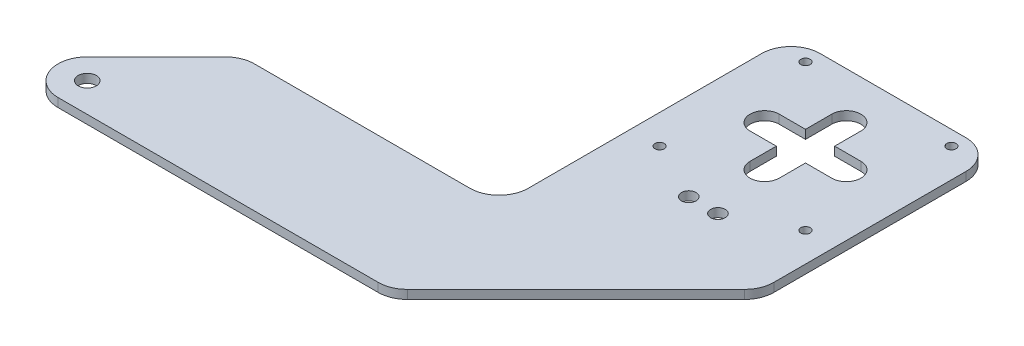
ISO-10303-21;
HEADER;
FILE_DESCRIPTION(('STEP AP214'),'2;1');
FILE_NAME('part.step','',(''),(''),'','','');
FILE_SCHEMA(('AUTOMOTIVE_DESIGN { 1 0 10303 214 1 1 1 1 }'));
ENDSEC;
DATA;
#1=APPLICATION_CONTEXT('core data for automotive mechanical design processes');
#2=APPLICATION_PROTOCOL_DEFINITION('international standard','automotive_design',2000,#1);
#3=PRODUCT_CONTEXT('',#1,'mechanical');
#4=PRODUCT('Part','Part','',(#3));
#5=PRODUCT_RELATED_PRODUCT_CATEGORY('part','',(#4));
#6=PRODUCT_DEFINITION_FORMATION('','',#4);
#7=PRODUCT_DEFINITION_CONTEXT('part definition',#1,'design');
#8=PRODUCT_DEFINITION('design','',#6,#7);
#9=PRODUCT_DEFINITION_SHAPE('','',#8);
#10=(LENGTH_UNIT() NAMED_UNIT(*) SI_UNIT(.MILLI.,.METRE.));
#11=(NAMED_UNIT(*) PLANE_ANGLE_UNIT() SI_UNIT($,.RADIAN.));
#12=(NAMED_UNIT(*) SI_UNIT($,.STERADIAN.) SOLID_ANGLE_UNIT());
#13=UNCERTAINTY_MEASURE_WITH_UNIT(LENGTH_MEASURE(1.E-05),#10,'distance_accuracy_value','');
#14=(GEOMETRIC_REPRESENTATION_CONTEXT(3) GLOBAL_UNCERTAINTY_ASSIGNED_CONTEXT((#13)) GLOBAL_UNIT_ASSIGNED_CONTEXT((#10,
#11,#12)) REPRESENTATION_CONTEXT('',''));
#15=CARTESIAN_POINT('',(0.,0.,0.));
#16=DIRECTION('',(0.,0.,1.));
#17=DIRECTION('',(1.,0.,0.));
#18=AXIS2_PLACEMENT_3D('',#15,#16,#17);
#19=CARTESIAN_POINT('',(0.,3.,0.));
#20=DIRECTION('',(0.,-1.,0.));
#21=DIRECTION('',(0.,0.,-1.));
#22=AXIS2_PLACEMENT_3D('',#19,#20,#21);
#23=PLANE('',#22);
#24=DIRECTION('',(1.,0.,0.));
#25=VECTOR('',#24,1.);
#26=CARTESIAN_POINT('',(11.,3.,-20.));
#27=LINE('',#26,#25);
#28=CARTESIAN_POINT('',(11.,3.,-20.));
#29=VERTEX_POINT('',#28);
#30=CARTESIAN_POINT('',(20.,3.,-20.));
#31=VERTEX_POINT('',#30);
#32=EDGE_CURVE('E258',#29,#31,#27,.T.);
#33=ORIENTED_EDGE('',*,*,#32,.F.);
#34=CARTESIAN_POINT('',(11.,3.,-25.));
#35=DIRECTION('',(0.,1.,0.));
#36=DIRECTION('',(0.,0.,1.));
#37=AXIS2_PLACEMENT_3D('',#34,#35,#36);
#38=CIRCLE('',#37,5.);
#39=CARTESIAN_POINT('',(11.,3.,-30.));
#40=VERTEX_POINT('',#39);
#41=EDGE_CURVE('E50',#40,#29,#38,.T.);
#42=ORIENTED_EDGE('',*,*,#41,.F.);
#43=DIRECTION('',(-1.,0.,0.));
#44=VECTOR('',#43,1.);
#45=CARTESIAN_POINT('',(11.,3.,-30.));
#46=LINE('',#45,#44);
#47=CARTESIAN_POINT('',(20.,3.,-30.));
#48=VERTEX_POINT('',#47);
#49=EDGE_CURVE('E226',#48,#40,#46,.T.);
#50=ORIENTED_EDGE('',*,*,#49,.F.);
#51=DIRECTION('',(0.,0.,1.));
#52=VECTOR('',#51,1.);
#53=CARTESIAN_POINT('',(20.,3.,-39.));
#54=LINE('',#53,#52);
#55=CARTESIAN_POINT('',(20.,3.,-39.));
#56=VERTEX_POINT('',#55);
#57=EDGE_CURVE('E229',#56,#48,#54,.T.);
#58=ORIENTED_EDGE('',*,*,#57,.F.);
#59=CARTESIAN_POINT('',(25.,3.,-39.));
#60=DIRECTION('',(0.,1.,0.));
#61=DIRECTION('',(0.,0.,-1.));
#62=AXIS2_PLACEMENT_3D('',#59,#60,#61);
#63=CIRCLE('',#62,4.99999999999999);
#64=CARTESIAN_POINT('',(30.,3.,-39.));
#65=VERTEX_POINT('',#64);
#66=EDGE_CURVE('E282',#65,#56,#63,.T.);
#67=ORIENTED_EDGE('',*,*,#66,.F.);
#68=DIRECTION('',(0.,0.,-1.));
#69=VECTOR('',#68,1.);
#70=CARTESIAN_POINT('',(30.,3.,-39.));
#71=LINE('',#70,#69);
#72=CARTESIAN_POINT('',(30.,3.,-30.));
#73=VERTEX_POINT('',#72);
#74=EDGE_CURVE('E279',#73,#65,#71,.T.);
#75=ORIENTED_EDGE('',*,*,#74,.F.);
#76=DIRECTION('',(-1.,0.,0.));
#77=VECTOR('',#76,1.);
#78=CARTESIAN_POINT('',(30.,3.,-30.));
#79=LINE('',#78,#77);
#80=CARTESIAN_POINT('',(39.,3.,-30.));
#81=VERTEX_POINT('',#80);
#82=EDGE_CURVE('E276',#81,#73,#79,.T.);
#83=ORIENTED_EDGE('',*,*,#82,.F.);
#84=CARTESIAN_POINT('',(39.,3.,-25.));
#85=DIRECTION('',(0.,1.,0.));
#86=DIRECTION('',(0.,0.,1.));
#87=AXIS2_PLACEMENT_3D('',#84,#85,#86);
#88=CIRCLE('',#87,5.);
#89=CARTESIAN_POINT('',(39.,3.,-20.));
#90=VERTEX_POINT('',#89);
#91=EDGE_CURVE('E273',#90,#81,#88,.T.);
#92=ORIENTED_EDGE('',*,*,#91,.F.);
#93=DIRECTION('',(1.,0.,0.));
#94=VECTOR('',#93,1.);
#95=CARTESIAN_POINT('',(30.,3.,-20.));
#96=LINE('',#95,#94);
#97=CARTESIAN_POINT('',(30.,3.,-20.));
#98=VERTEX_POINT('',#97);
#99=EDGE_CURVE('E270',#98,#90,#96,.T.);
#100=ORIENTED_EDGE('',*,*,#99,.F.);
#101=DIRECTION('',(0.,0.,-1.));
#102=VECTOR('',#101,1.);
#103=CARTESIAN_POINT('',(30.,3.,-20.));
#104=LINE('',#103,#102);
#105=CARTESIAN_POINT('',(30.,3.,-11.));
#106=VERTEX_POINT('',#105);
#107=EDGE_CURVE('E267',#106,#98,#104,.T.);
#108=ORIENTED_EDGE('',*,*,#107,.F.);
#109=CARTESIAN_POINT('',(25.,3.,-11.));
#110=DIRECTION('',(0.,1.,0.));
#111=DIRECTION('',(0.,0.,-1.));
#112=AXIS2_PLACEMENT_3D('',#109,#110,#111);
#113=CIRCLE('',#112,4.99999999999999);
#114=CARTESIAN_POINT('',(20.,3.,-11.));
#115=VERTEX_POINT('',#114);
#116=EDGE_CURVE('E264',#115,#106,#113,.T.);
#117=ORIENTED_EDGE('',*,*,#116,.F.);
#118=DIRECTION('',(0.,0.,1.));
#119=VECTOR('',#118,1.);
#120=CARTESIAN_POINT('',(20.,3.,-20.));
#121=LINE('',#120,#119);
#122=EDGE_CURVE('E261',#31,#115,#121,.T.);
#123=ORIENTED_EDGE('',*,*,#122,.F.);
#124=EDGE_LOOP('',(#33,#42,#50,#58,#67,#75,#83,#92,#100,#108,#117,#123));
#125=FACE_BOUND('',#124,.T.);
#126=CARTESIAN_POINT('',(20.,3.,10.));
#127=DIRECTION('',(0.,1.,0.));
#128=DIRECTION('',(0.,0.,1.));
#129=AXIS2_PLACEMENT_3D('',#126,#127,#128);
#130=CIRCLE('',#129,2.5);
#131=CARTESIAN_POINT('',(20.,3.,12.5));
#132=VERTEX_POINT('',#131);
#133=EDGE_CURVE('E311',#132,#132,#130,.T.);
#134=ORIENTED_EDGE('',*,*,#133,.F.);
#135=EDGE_LOOP('',(#134));
#136=FACE_BOUND('',#135,.T.);
#137=CARTESIAN_POINT('',(30.,3.,10.));
#138=DIRECTION('',(0.,1.,0.));
#139=DIRECTION('',(0.,0.,-1.));
#140=AXIS2_PLACEMENT_3D('',#137,#138,#139);
#141=CIRCLE('',#140,2.5);
#142=CARTESIAN_POINT('',(30.,3.,7.5));
#143=VERTEX_POINT('',#142);
#144=EDGE_CURVE('E317',#143,#143,#141,.T.);
#145=ORIENTED_EDGE('',*,*,#144,.F.);
#146=EDGE_LOOP('',(#145));
#147=FACE_BOUND('',#146,.T.);
#148=CARTESIAN_POINT('',(-117.497474683059,3.,78.639610306789));
#149=DIRECTION('',(0.,1.,0.));
#150=DIRECTION('',(0.,0.,1.));
#151=AXIS2_PLACEMENT_3D('',#148,#149,#150);
#152=CIRCLE('',#151,3.09999999999999);
#153=CARTESIAN_POINT('',(-117.497474683059,3.,81.739610306789));
#154=VERTEX_POINT('',#153);
#155=EDGE_CURVE('E289',#154,#154,#152,.T.);
#156=ORIENTED_EDGE('',*,*,#155,.F.);
#157=EDGE_LOOP('',(#156));
#158=FACE_BOUND('',#157,.T.);
#159=DIRECTION('',(-0.707106781186549,0.,0.707106781186546));
#160=VECTOR('',#159,1.);
#161=CARTESIAN_POINT('',(-141.63961030679,3.,88.639610306789));
#162=LINE('',#161,#160);
#163=CARTESIAN_POINT('',(-100.928932188135,3.,47.9289321881345));
#164=VERTEX_POINT('',#163);
#165=CARTESIAN_POINT('',(-124.568542494924,3.,71.5685424949234));
#166=VERTEX_POINT('',#165);
#167=EDGE_CURVE('E325',#164,#166,#162,.T.);
#168=ORIENTED_EDGE('',*,*,#167,.T.);
#169=CARTESIAN_POINT('',(-117.497474683059,3.,78.6396103067889));
#170=DIRECTION('',(0.,-1.,0.));
#171=DIRECTION('',(0.,0.,-1.));
#172=AXIS2_PLACEMENT_3D('',#169,#170,#171);
#173=CIRCLE('',#172,10.);
#174=CARTESIAN_POINT('',(-117.497474683059,3.,88.639610306789));
#175=VERTEX_POINT('',#174);
#176=EDGE_CURVE('E43',#166,#175,#173,.F.);
#177=ORIENTED_EDGE('',*,*,#176,.T.);
#178=DIRECTION('',(1.,0.,0.));
#179=VECTOR('',#178,1.);
#180=CARTESIAN_POINT('',(-141.63961030679,3.,88.639610306789));
#181=LINE('',#180,#179);
#182=CARTESIAN_POINT('',(-7.78174593052058,3.,88.6396103067889));
#183=VERTEX_POINT('',#182);
#184=EDGE_CURVE('E329',#175,#183,#181,.T.);
#185=ORIENTED_EDGE('',*,*,#184,.T.);
#186=CARTESIAN_POINT('',(-7.78174593052053,3.,78.639610306789));
#187=DIRECTION('',(0.,-1.,0.));
#188=DIRECTION('',(0.,0.,-1.));
#189=AXIS2_PLACEMENT_3D('',#186,#187,#188);
#190=CIRCLE('',#189,10.);
#191=CARTESIAN_POINT('',(-0.710678118655064,3.,85.7106781186545));
#192=VERTEX_POINT('',#191);
#193=EDGE_CURVE('E409',#183,#192,#190,.F.);
#194=ORIENTED_EDGE('',*,*,#193,.T.);
#195=DIRECTION('',(0.707106781186551,0.,-0.707106781186544));
#196=VECTOR('',#195,1.);
#197=CARTESIAN_POINT('',(60.,3.,25.));
#198=LINE('',#197,#196);
#199=CARTESIAN_POINT('',(57.0710678118654,3.,27.9289321881345));
#200=VERTEX_POINT('',#199);
#201=EDGE_CURVE('E331',#192,#200,#198,.T.);
#202=ORIENTED_EDGE('',*,*,#201,.T.);
#203=CARTESIAN_POINT('',(50.,3.,20.857864376269));
#204=DIRECTION('',(0.,-1.,0.));
#205=DIRECTION('',(0.,0.,-1.));
#206=AXIS2_PLACEMENT_3D('',#203,#204,#205);
#207=CIRCLE('',#206,10.);
#208=CARTESIAN_POINT('',(60.,3.,20.857864376269));
#209=VERTEX_POINT('',#208);
#210=EDGE_CURVE('E403',#200,#209,#207,.F.);
#211=ORIENTED_EDGE('',*,*,#210,.T.);
#212=DIRECTION('',(0.,0.,-1.));
#213=VECTOR('',#212,1.);
#214=CARTESIAN_POINT('',(60.,3.,5.));
#215=LINE('',#214,#213);
#216=CARTESIAN_POINT('',(60.,3.,-45.));
#217=VERTEX_POINT('',#216);
#218=EDGE_CURVE('E369',#209,#217,#215,.T.);
#219=ORIENTED_EDGE('',*,*,#218,.T.);
#220=CARTESIAN_POINT('',(50.,3.,-45.));
#221=DIRECTION('',(0.,-1.,0.));
#222=DIRECTION('',(0.,0.,-1.));
#223=AXIS2_PLACEMENT_3D('',#220,#221,#222);
#224=CIRCLE('',#223,10.);
#225=CARTESIAN_POINT('',(50.,3.,-55.));
#226=VERTEX_POINT('',#225);
#227=EDGE_CURVE('E405',#217,#226,#224,.F.);
#228=ORIENTED_EDGE('',*,*,#227,.T.);
#229=DIRECTION('',(-1.,0.,0.));
#230=VECTOR('',#229,1.);
#231=CARTESIAN_POINT('',(-10.,3.,-55.));
#232=LINE('',#231,#230);
#233=CARTESIAN_POINT('',(0.,3.,-55.));
#234=VERTEX_POINT('',#233);
#235=EDGE_CURVE('E372',#226,#234,#232,.T.);
#236=ORIENTED_EDGE('',*,*,#235,.T.);
#237=CARTESIAN_POINT('',(0.,3.,-45.));
#238=DIRECTION('',(0.,-1.,0.));
#239=DIRECTION('',(0.,0.,-1.));
#240=AXIS2_PLACEMENT_3D('',#237,#238,#239);
#241=CIRCLE('',#240,10.);
#242=CARTESIAN_POINT('',(-10.,3.,-45.));
#243=VERTEX_POINT('',#242);
#244=EDGE_CURVE('E407',#234,#243,#241,.F.);
#245=ORIENTED_EDGE('',*,*,#244,.T.);
#246=DIRECTION('',(0.,0.,1.));
#247=VECTOR('',#246,1.);
#248=CARTESIAN_POINT('',(-10.,3.,5.));
#249=LINE('',#248,#247);
#250=CARTESIAN_POINT('',(-10.,3.,35.));
#251=VERTEX_POINT('',#250);
#252=EDGE_CURVE('E376',#243,#251,#249,.T.);
#253=ORIENTED_EDGE('',*,*,#252,.T.);
#254=CARTESIAN_POINT('',(-20.,3.,35.));
#255=DIRECTION('',(0.,-1.,0.));
#256=DIRECTION('',(0.,0.,-1.));
#257=AXIS2_PLACEMENT_3D('',#254,#255,#256);
#258=CIRCLE('',#257,10.);
#259=CARTESIAN_POINT('',(-20.,3.,45.));
#260=VERTEX_POINT('',#259);
#261=EDGE_CURVE('E431',#251,#260,#258,.T.);
#262=ORIENTED_EDGE('',*,*,#261,.T.);
#263=DIRECTION('',(-1.,0.,0.));
#264=VECTOR('',#263,1.);
#265=CARTESIAN_POINT('',(-9.99999999999999,3.,45.));
#266=LINE('',#265,#264);
#267=CARTESIAN_POINT('',(-93.8578643762696,3.,45.));
#268=VERTEX_POINT('',#267);
#269=EDGE_CURVE('E322',#260,#268,#266,.T.);
#270=ORIENTED_EDGE('',*,*,#269,.T.);
#271=CARTESIAN_POINT('',(-93.8578643762696,3.,55.));
#272=DIRECTION('',(0.,-1.,0.));
#273=DIRECTION('',(0.,0.,-1.));
#274=AXIS2_PLACEMENT_3D('',#271,#272,#273);
#275=CIRCLE('',#274,10.);
#276=EDGE_CURVE('E445',#268,#164,#275,.F.);
#277=ORIENTED_EDGE('',*,*,#276,.T.);
#278=EDGE_LOOP('',(#168,#177,#185,#194,#202,#211,#219,#228,#236,#245,#253,#262,#270,#277));
#279=FACE_BOUND('',#278,.T.);
#280=CARTESIAN_POINT('',(0.,3.,-50.));
#281=DIRECTION('',(0.,1.,0.));
#282=DIRECTION('',(0.,0.,1.));
#283=AXIS2_PLACEMENT_3D('',#280,#281,#282);
#284=CIRCLE('',#283,1.6);
#285=CARTESIAN_POINT('',(0.,3.,-48.4));
#286=VERTEX_POINT('',#285);
#287=EDGE_CURVE('E363',#286,#286,#284,.T.);
#288=ORIENTED_EDGE('',*,*,#287,.F.);
#289=EDGE_LOOP('',(#288));
#290=FACE_BOUND('',#289,.T.);
#291=CARTESIAN_POINT('',(50.,3.,-50.));
#292=DIRECTION('',(0.,1.,0.));
#293=DIRECTION('',(0.,0.,-1.));
#294=AXIS2_PLACEMENT_3D('',#291,#292,#293);
#295=CIRCLE('',#294,1.60000000000001);
#296=CARTESIAN_POINT('',(50.,3.,-51.6));
#297=VERTEX_POINT('',#296);
#298=EDGE_CURVE('E357',#297,#297,#295,.T.);
#299=ORIENTED_EDGE('',*,*,#298,.F.);
#300=EDGE_LOOP('',(#299));
#301=FACE_BOUND('',#300,.T.);
#302=CARTESIAN_POINT('',(50.,3.,0.));
#303=DIRECTION('',(0.,1.,0.));
#304=DIRECTION('',(0.,0.,1.));
#305=AXIS2_PLACEMENT_3D('',#302,#303,#304);
#306=CIRCLE('',#305,1.60000000000001);
#307=CARTESIAN_POINT('',(50.,3.,1.60000000000001));
#308=VERTEX_POINT('',#307);
#309=EDGE_CURVE('E351',#308,#308,#306,.T.);
#310=ORIENTED_EDGE('',*,*,#309,.F.);
#311=EDGE_LOOP('',(#310));
#312=FACE_BOUND('',#311,.T.);
#313=CARTESIAN_POINT('',(0.,3.,0.));
#314=DIRECTION('',(0.,1.,0.));
#315=DIRECTION('',(0.,0.,-1.));
#316=AXIS2_PLACEMENT_3D('',#313,#314,#315);
#317=CIRCLE('',#316,1.6);
#318=CARTESIAN_POINT('',(0.,3.,-1.6));
#319=VERTEX_POINT('',#318);
#320=EDGE_CURVE('E345',#319,#319,#317,.T.);
#321=ORIENTED_EDGE('',*,*,#320,.F.);
#322=EDGE_LOOP('',(#321));
#323=FACE_BOUND('',#322,.T.);
#324=ADVANCED_FACE('F34',(#125,#136,#147,#158,#279,#290,#301,#312,#323),#23,.F.);
#325=CARTESIAN_POINT('',(0.,0.,0.));
#326=DIRECTION('',(0.,-1.,0.));
#327=DIRECTION('',(0.,0.,-1.));
#328=AXIS2_PLACEMENT_3D('',#325,#326,#327);
#329=PLANE('',#328);
#330=CARTESIAN_POINT('',(11.,0.,-25.));
#331=DIRECTION('',(0.,1.,0.));
#332=DIRECTION('',(0.,0.,1.));
#333=AXIS2_PLACEMENT_3D('',#330,#331,#332);
#334=CIRCLE('',#333,5.);
#335=CARTESIAN_POINT('',(11.,0.,-30.));
#336=VERTEX_POINT('',#335);
#337=CARTESIAN_POINT('',(11.,0.,-20.));
#338=VERTEX_POINT('',#337);
#339=EDGE_CURVE('E209',#336,#338,#334,.T.);
#340=ORIENTED_EDGE('',*,*,#339,.T.);
#341=DIRECTION('',(1.,0.,0.));
#342=VECTOR('',#341,1.);
#343=CARTESIAN_POINT('',(11.,0.,-20.));
#344=LINE('',#343,#342);
#345=CARTESIAN_POINT('',(20.,0.,-20.));
#346=VERTEX_POINT('',#345);
#347=EDGE_CURVE('E218',#338,#346,#344,.T.);
#348=ORIENTED_EDGE('',*,*,#347,.T.);
#349=DIRECTION('',(0.,0.,1.));
#350=VECTOR('',#349,1.);
#351=CARTESIAN_POINT('',(20.,0.,-20.));
#352=LINE('',#351,#350);
#353=CARTESIAN_POINT('',(20.,0.,-11.));
#354=VERTEX_POINT('',#353);
#355=EDGE_CURVE('E58',#346,#354,#352,.T.);
#356=ORIENTED_EDGE('',*,*,#355,.T.);
#357=CARTESIAN_POINT('',(25.,0.,-11.));
#358=DIRECTION('',(0.,1.,0.));
#359=DIRECTION('',(0.,0.,-1.));
#360=AXIS2_PLACEMENT_3D('',#357,#358,#359);
#361=CIRCLE('',#360,4.99999999999999);
#362=CARTESIAN_POINT('',(30.,0.,-11.));
#363=VERTEX_POINT('',#362);
#364=EDGE_CURVE('E233',#354,#363,#361,.T.);
#365=ORIENTED_EDGE('',*,*,#364,.T.);
#366=DIRECTION('',(0.,0.,-1.));
#367=VECTOR('',#366,1.);
#368=CARTESIAN_POINT('',(30.,0.,-20.));
#369=LINE('',#368,#367);
#370=CARTESIAN_POINT('',(30.,0.,-20.));
#371=VERTEX_POINT('',#370);
#372=EDGE_CURVE('E236',#363,#371,#369,.T.);
#373=ORIENTED_EDGE('',*,*,#372,.T.);
#374=DIRECTION('',(1.,0.,0.));
#375=VECTOR('',#374,1.);
#376=CARTESIAN_POINT('',(30.,0.,-20.));
#377=LINE('',#376,#375);
#378=CARTESIAN_POINT('',(39.,0.,-20.));
#379=VERTEX_POINT('',#378);
#380=EDGE_CURVE('E239',#371,#379,#377,.T.);
#381=ORIENTED_EDGE('',*,*,#380,.T.);
#382=CARTESIAN_POINT('',(39.,0.,-25.));
#383=DIRECTION('',(0.,1.,0.));
#384=DIRECTION('',(0.,0.,1.));
#385=AXIS2_PLACEMENT_3D('',#382,#383,#384);
#386=CIRCLE('',#385,5.);
#387=CARTESIAN_POINT('',(39.,0.,-30.));
#388=VERTEX_POINT('',#387);
#389=EDGE_CURVE('E242',#379,#388,#386,.T.);
#390=ORIENTED_EDGE('',*,*,#389,.T.);
#391=DIRECTION('',(-1.,0.,0.));
#392=VECTOR('',#391,1.);
#393=CARTESIAN_POINT('',(30.,0.,-30.));
#394=LINE('',#393,#392);
#395=CARTESIAN_POINT('',(30.,0.,-30.));
#396=VERTEX_POINT('',#395);
#397=EDGE_CURVE('E245',#388,#396,#394,.T.);
#398=ORIENTED_EDGE('',*,*,#397,.T.);
#399=DIRECTION('',(0.,0.,-1.));
#400=VECTOR('',#399,1.);
#401=CARTESIAN_POINT('',(30.,0.,-39.));
#402=LINE('',#401,#400);
#403=CARTESIAN_POINT('',(30.,0.,-39.));
#404=VERTEX_POINT('',#403);
#405=EDGE_CURVE('E248',#396,#404,#402,.T.);
#406=ORIENTED_EDGE('',*,*,#405,.T.);
#407=CARTESIAN_POINT('',(25.,0.,-39.));
#408=DIRECTION('',(0.,1.,0.));
#409=DIRECTION('',(0.,0.,-1.));
#410=AXIS2_PLACEMENT_3D('',#407,#408,#409);
#411=CIRCLE('',#410,4.99999999999999);
#412=CARTESIAN_POINT('',(20.,0.,-39.));
#413=VERTEX_POINT('',#412);
#414=EDGE_CURVE('E251',#404,#413,#411,.T.);
#415=ORIENTED_EDGE('',*,*,#414,.T.);
#416=DIRECTION('',(0.,0.,1.));
#417=VECTOR('',#416,1.);
#418=CARTESIAN_POINT('',(20.,0.,-39.));
#419=LINE('',#418,#417);
#420=CARTESIAN_POINT('',(20.,0.,-30.));
#421=VERTEX_POINT('',#420);
#422=EDGE_CURVE('E254',#413,#421,#419,.T.);
#423=ORIENTED_EDGE('',*,*,#422,.T.);
#424=DIRECTION('',(-1.,0.,0.));
#425=VECTOR('',#424,1.);
#426=CARTESIAN_POINT('',(11.,0.,-30.));
#427=LINE('',#426,#425);
#428=EDGE_CURVE('E215',#421,#336,#427,.T.);
#429=ORIENTED_EDGE('',*,*,#428,.T.);
#430=EDGE_LOOP('',(#340,#348,#356,#365,#373,#381,#390,#398,#406,#415,#423,#429));
#431=FACE_BOUND('',#430,.T.);
#432=CARTESIAN_POINT('',(20.,0.,10.));
#433=DIRECTION('',(0.,1.,0.));
#434=DIRECTION('',(0.,0.,1.));
#435=AXIS2_PLACEMENT_3D('',#432,#433,#434);
#436=CIRCLE('',#435,2.5);
#437=CARTESIAN_POINT('',(20.,0.,12.5));
#438=VERTEX_POINT('',#437);
#439=EDGE_CURVE('E259',#438,#438,#436,.T.);
#440=ORIENTED_EDGE('',*,*,#439,.T.);
#441=EDGE_LOOP('',(#440));
#442=FACE_BOUND('',#441,.T.);
#443=CARTESIAN_POINT('',(30.,0.,10.));
#444=DIRECTION('',(0.,1.,0.));
#445=DIRECTION('',(0.,0.,-1.));
#446=AXIS2_PLACEMENT_3D('',#443,#444,#445);
#447=CIRCLE('',#446,2.5);
#448=CARTESIAN_POINT('',(30.,0.,7.5));
#449=VERTEX_POINT('',#448);
#450=EDGE_CURVE('E314',#449,#449,#447,.T.);
#451=ORIENTED_EDGE('',*,*,#450,.T.);
#452=EDGE_LOOP('',(#451));
#453=FACE_BOUND('',#452,.T.);
#454=CARTESIAN_POINT('',(-117.497474683059,0.,78.639610306789));
#455=DIRECTION('',(0.,-1.,0.));
#456=DIRECTION('',(0.,0.,-1.));
#457=AXIS2_PLACEMENT_3D('',#454,#455,#456);
#458=CIRCLE('',#457,3.09999999999999);
#459=CARTESIAN_POINT('',(-117.497474683059,0.,75.539610306789));
#460=VERTEX_POINT('',#459);
#461=EDGE_CURVE('E38',#460,#460,#458,.T.);
#462=ORIENTED_EDGE('',*,*,#461,.F.);
#463=EDGE_LOOP('',(#462));
#464=FACE_BOUND('',#463,.T.);
#465=CARTESIAN_POINT('',(50.,0.,0.));
#466=DIRECTION('',(0.,1.,0.));
#467=DIRECTION('',(0.,0.,1.));
#468=AXIS2_PLACEMENT_3D('',#465,#466,#467);
#469=CIRCLE('',#468,1.60000000000001);
#470=CARTESIAN_POINT('',(50.,0.,1.60000000000001));
#471=VERTEX_POINT('',#470);
#472=EDGE_CURVE('E348',#471,#471,#469,.T.);
#473=ORIENTED_EDGE('',*,*,#472,.T.);
#474=EDGE_LOOP('',(#473));
#475=FACE_BOUND('',#474,.T.);
#476=CARTESIAN_POINT('',(0.,0.,-50.));
#477=DIRECTION('',(0.,1.,0.));
#478=DIRECTION('',(0.,0.,1.));
#479=AXIS2_PLACEMENT_3D('',#476,#477,#478);
#480=CIRCLE('',#479,1.6);
#481=CARTESIAN_POINT('',(0.,0.,-48.4));
#482=VERTEX_POINT('',#481);
#483=EDGE_CURVE('E360',#482,#482,#480,.T.);
#484=ORIENTED_EDGE('',*,*,#483,.T.);
#485=EDGE_LOOP('',(#484));
#486=FACE_BOUND('',#485,.T.);
#487=DIRECTION('',(1.,0.,0.));
#488=VECTOR('',#487,1.);
#489=CARTESIAN_POINT('',(-58.1724445328613,0.,88.639610306789));
#490=LINE('',#489,#488);
#491=CARTESIAN_POINT('',(-117.497474683059,0.,88.6396103067889));
#492=VERTEX_POINT('',#491);
#493=CARTESIAN_POINT('',(-7.78174593052055,0.,88.639610306789));
#494=VERTEX_POINT('',#493);
#495=EDGE_CURVE('E341',#492,#494,#490,.T.);
#496=ORIENTED_EDGE('',*,*,#495,.F.);
#497=CARTESIAN_POINT('',(-117.497474683059,0.,78.6396103067889));
#498=DIRECTION('',(0.,-1.,0.));
#499=DIRECTION('',(0.,0.,-1.));
#500=AXIS2_PLACEMENT_3D('',#497,#498,#499);
#501=CIRCLE('',#500,10.);
#502=CARTESIAN_POINT('',(-124.568542494924,0.,71.5685424949234));
#503=VERTEX_POINT('',#502);
#504=EDGE_CURVE('E438',#492,#503,#501,.T.);
#505=ORIENTED_EDGE('',*,*,#504,.T.);
#506=DIRECTION('',(-0.707106781186549,0.,0.707106781186546));
#507=VECTOR('',#506,1.);
#508=CARTESIAN_POINT('',(-141.63961030679,0.,88.639610306789));
#509=LINE('',#508,#507);
#510=CARTESIAN_POINT('',(-100.928932188135,0.,47.9289321881345));
#511=VERTEX_POINT('',#510);
#512=EDGE_CURVE('E338',#511,#503,#509,.T.);
#513=ORIENTED_EDGE('',*,*,#512,.F.);
#514=CARTESIAN_POINT('',(-93.8578643762696,0.,55.));
#515=DIRECTION('',(0.,-1.,0.));
#516=DIRECTION('',(0.,0.,-1.));
#517=AXIS2_PLACEMENT_3D('',#514,#515,#516);
#518=CIRCLE('',#517,10.);
#519=CARTESIAN_POINT('',(-93.8578643762696,0.,45.));
#520=VERTEX_POINT('',#519);
#521=EDGE_CURVE('E436',#511,#520,#518,.T.);
#522=ORIENTED_EDGE('',*,*,#521,.T.);
#523=DIRECTION('',(-1.,0.,0.));
#524=VECTOR('',#523,1.);
#525=CARTESIAN_POINT('',(-9.99999999999999,0.,45.));
#526=LINE('',#525,#524);
#527=CARTESIAN_POINT('',(-20.,0.,45.));
#528=VERTEX_POINT('',#527);
#529=EDGE_CURVE('E335',#528,#520,#526,.T.);
#530=ORIENTED_EDGE('',*,*,#529,.F.);
#531=CARTESIAN_POINT('',(-20.,0.,35.));
#532=DIRECTION('',(0.,-1.,0.));
#533=DIRECTION('',(0.,0.,-1.));
#534=AXIS2_PLACEMENT_3D('',#531,#532,#533);
#535=CIRCLE('',#534,10.);
#536=CARTESIAN_POINT('',(-10.,0.,35.));
#537=VERTEX_POINT('',#536);
#538=EDGE_CURVE('E429',#528,#537,#535,.F.);
#539=ORIENTED_EDGE('',*,*,#538,.T.);
#540=DIRECTION('',(0.,0.,1.));
#541=VECTOR('',#540,1.);
#542=CARTESIAN_POINT('',(-10.,0.,5.));
#543=LINE('',#542,#541);
#544=CARTESIAN_POINT('',(-10.,0.,-45.));
#545=VERTEX_POINT('',#544);
#546=EDGE_CURVE('E373',#545,#537,#543,.T.);
#547=ORIENTED_EDGE('',*,*,#546,.F.);
#548=CARTESIAN_POINT('',(0.,0.,-45.));
#549=DIRECTION('',(0.,-1.,0.));
#550=DIRECTION('',(0.,0.,-1.));
#551=AXIS2_PLACEMENT_3D('',#548,#549,#550);
#552=CIRCLE('',#551,10.);
#553=CARTESIAN_POINT('',(0.,0.,-55.));
#554=VERTEX_POINT('',#553);
#555=EDGE_CURVE('E395',#545,#554,#552,.T.);
#556=ORIENTED_EDGE('',*,*,#555,.T.);
#557=DIRECTION('',(-1.,0.,0.));
#558=VECTOR('',#557,1.);
#559=CARTESIAN_POINT('',(-10.,0.,-55.));
#560=LINE('',#559,#558);
#561=CARTESIAN_POINT('',(50.,0.,-55.));
#562=VERTEX_POINT('',#561);
#563=EDGE_CURVE('E382',#562,#554,#560,.T.);
#564=ORIENTED_EDGE('',*,*,#563,.F.);
#565=CARTESIAN_POINT('',(50.,0.,-45.));
#566=DIRECTION('',(0.,-1.,0.));
#567=DIRECTION('',(0.,0.,-1.));
#568=AXIS2_PLACEMENT_3D('',#565,#566,#567);
#569=CIRCLE('',#568,10.);
#570=CARTESIAN_POINT('',(60.,0.,-45.));
#571=VERTEX_POINT('',#570);
#572=EDGE_CURVE('E393',#562,#571,#569,.T.);
#573=ORIENTED_EDGE('',*,*,#572,.T.);
#574=DIRECTION('',(0.,0.,-1.));
#575=VECTOR('',#574,1.);
#576=CARTESIAN_POINT('',(60.,0.,5.));
#577=LINE('',#576,#575);
#578=CARTESIAN_POINT('',(60.,0.,20.857864376269));
#579=VERTEX_POINT('',#578);
#580=EDGE_CURVE('E366',#579,#571,#577,.T.);
#581=ORIENTED_EDGE('',*,*,#580,.F.);
#582=CARTESIAN_POINT('',(50.,0.,20.857864376269));
#583=DIRECTION('',(0.,-1.,0.));
#584=DIRECTION('',(0.,0.,-1.));
#585=AXIS2_PLACEMENT_3D('',#582,#583,#584);
#586=CIRCLE('',#585,10.);
#587=CARTESIAN_POINT('',(57.0710678118654,0.,27.9289321881345));
#588=VERTEX_POINT('',#587);
#589=EDGE_CURVE('E391',#579,#588,#586,.T.);
#590=ORIENTED_EDGE('',*,*,#589,.T.);
#591=DIRECTION('',(0.707106781186551,0.,-0.707106781186544));
#592=VECTOR('',#591,1.);
#593=CARTESIAN_POINT('',(60.,0.,25.));
#594=LINE('',#593,#592);
#595=CARTESIAN_POINT('',(-0.710678118655064,0.,85.7106781186545));
#596=VERTEX_POINT('',#595);
#597=EDGE_CURVE('E326',#596,#588,#594,.T.);
#598=ORIENTED_EDGE('',*,*,#597,.F.);
#599=CARTESIAN_POINT('',(-7.78174593052053,0.,78.639610306789));
#600=DIRECTION('',(0.,-1.,0.));
#601=DIRECTION('',(0.,0.,-1.));
#602=AXIS2_PLACEMENT_3D('',#599,#600,#601);
#603=CIRCLE('',#602,10.);
#604=EDGE_CURVE('E397',#596,#494,#603,.T.);
#605=ORIENTED_EDGE('',*,*,#604,.T.);
#606=EDGE_LOOP('',(#496,#505,#513,#522,#530,#539,#547,#556,#564,#573,#581,#590,#598,#605));
#607=FACE_BOUND('',#606,.T.);
#608=CARTESIAN_POINT('',(50.,0.,-50.));
#609=DIRECTION('',(0.,1.,0.));
#610=DIRECTION('',(0.,0.,-1.));
#611=AXIS2_PLACEMENT_3D('',#608,#609,#610);
#612=CIRCLE('',#611,1.60000000000001);
#613=CARTESIAN_POINT('',(50.,0.,-51.6));
#614=VERTEX_POINT('',#613);
#615=EDGE_CURVE('E354',#614,#614,#612,.T.);
#616=ORIENTED_EDGE('',*,*,#615,.T.);
#617=EDGE_LOOP('',(#616));
#618=FACE_BOUND('',#617,.T.);
#619=CARTESIAN_POINT('',(0.,0.,0.));
#620=DIRECTION('',(0.,1.,0.));
#621=DIRECTION('',(0.,0.,-1.));
#622=AXIS2_PLACEMENT_3D('',#619,#620,#621);
#623=CIRCLE('',#622,1.6);
#624=CARTESIAN_POINT('',(0.,0.,-1.6));
#625=VERTEX_POINT('',#624);
#626=EDGE_CURVE('E334',#625,#625,#623,.T.);
#627=ORIENTED_EDGE('',*,*,#626,.T.);
#628=EDGE_LOOP('',(#627));
#629=FACE_BOUND('',#628,.T.);
#630=ADVANCED_FACE('F222',(#431,#442,#453,#464,#475,#486,#607,#618,#629),#329,.T.);
#631=CARTESIAN_POINT('',(60.,3.,5.));
#632=DIRECTION('',(-1.,0.,0.));
#633=DIRECTION('',(0.,0.,1.));
#634=AXIS2_PLACEMENT_3D('',#631,#632,#633);
#635=PLANE('',#634);
#636=ORIENTED_EDGE('',*,*,#580,.T.);
#637=DIRECTION('',(0.,-1.,0.));
#638=VECTOR('',#637,1.);
#639=CARTESIAN_POINT('',(60.,3.,-45.));
#640=LINE('',#639,#638);
#641=EDGE_CURVE('E424',#571,#217,#640,.F.);
#642=ORIENTED_EDGE('',*,*,#641,.T.);
#643=ORIENTED_EDGE('',*,*,#218,.F.);
#644=DIRECTION('',(0.,-1.,0.));
#645=VECTOR('',#644,1.);
#646=CARTESIAN_POINT('',(60.,3.,20.857864376269));
#647=LINE('',#646,#645);
#648=EDGE_CURVE('E421',#209,#579,#647,.T.);
#649=ORIENTED_EDGE('',*,*,#648,.T.);
#650=EDGE_LOOP('',(#636,#642,#643,#649));
#651=FACE_BOUND('',#650,.T.);
#652=ADVANCED_FACE('F499',(#651),#635,.F.);
#653=CARTESIAN_POINT('',(-10.,3.,-55.));
#654=DIRECTION('',(0.,0.,1.));
#655=DIRECTION('',(1.,0.,0.));
#656=AXIS2_PLACEMENT_3D('',#653,#654,#655);
#657=PLANE('',#656);
#658=ORIENTED_EDGE('',*,*,#563,.T.);
#659=DIRECTION('',(0.,-1.,0.));
#660=VECTOR('',#659,1.);
#661=CARTESIAN_POINT('',(0.,3.,-55.));
#662=LINE('',#661,#660);
#663=EDGE_CURVE('E419',#554,#234,#662,.F.);
#664=ORIENTED_EDGE('',*,*,#663,.T.);
#665=ORIENTED_EDGE('',*,*,#235,.F.);
#666=DIRECTION('',(0.,-1.,0.));
#667=VECTOR('',#666,1.);
#668=CARTESIAN_POINT('',(50.,3.,-55.));
#669=LINE('',#668,#667);
#670=EDGE_CURVE('E416',#226,#562,#669,.T.);
#671=ORIENTED_EDGE('',*,*,#670,.T.);
#672=EDGE_LOOP('',(#658,#664,#665,#671));
#673=FACE_BOUND('',#672,.T.);
#674=ADVANCED_FACE('F490',(#673),#657,.F.);
#675=CARTESIAN_POINT('',(-10.,3.,5.));
#676=DIRECTION('',(1.,0.,0.));
#677=DIRECTION('',(0.,0.,-1.));
#678=AXIS2_PLACEMENT_3D('',#675,#676,#677);
#679=PLANE('',#678);
#680=ORIENTED_EDGE('',*,*,#252,.F.);
#681=DIRECTION('',(0.,-1.,0.));
#682=VECTOR('',#681,1.);
#683=CARTESIAN_POINT('',(-10.,3.,-45.));
#684=LINE('',#683,#682);
#685=EDGE_CURVE('E413',#243,#545,#684,.T.);
#686=ORIENTED_EDGE('',*,*,#685,.T.);
#687=ORIENTED_EDGE('',*,*,#546,.T.);
#688=DIRECTION('',(0.,-1.,0.));
#689=VECTOR('',#688,1.);
#690=CARTESIAN_POINT('',(-10.,3.,35.));
#691=LINE('',#690,#689);
#692=EDGE_CURVE('E411',#537,#251,#691,.F.);
#693=ORIENTED_EDGE('',*,*,#692,.T.);
#694=EDGE_LOOP('',(#680,#686,#687,#693));
#695=FACE_BOUND('',#694,.T.);
#696=ADVANCED_FACE('F482',(#695),#679,.F.);
#697=CARTESIAN_POINT('',(0.,3.,-50.));
#698=DIRECTION('',(0.,-1.,0.));
#699=DIRECTION('',(0.,0.,-1.));
#700=AXIS2_PLACEMENT_3D('',#697,#698,#699);
#701=CYLINDRICAL_SURFACE('',#700,1.6);
#702=ORIENTED_EDGE('',*,*,#287,.T.);
#703=EDGE_LOOP('',(#702));
#704=FACE_BOUND('',#703,.T.);
#705=ORIENTED_EDGE('',*,*,#483,.F.);
#706=EDGE_LOOP('',(#705));
#707=FACE_BOUND('',#706,.T.);
#708=ADVANCED_FACE('F531',(#704,#707),#701,.F.);
#709=CARTESIAN_POINT('',(50.,3.,-50.));
#710=DIRECTION('',(0.,-1.,0.));
#711=DIRECTION('',(0.,0.,-1.));
#712=AXIS2_PLACEMENT_3D('',#709,#710,#711);
#713=CYLINDRICAL_SURFACE('',#712,1.60000000000001);
#714=ORIENTED_EDGE('',*,*,#298,.T.);
#715=EDGE_LOOP('',(#714));
#716=FACE_BOUND('',#715,.T.);
#717=ORIENTED_EDGE('',*,*,#615,.F.);
#718=EDGE_LOOP('',(#717));
#719=FACE_BOUND('',#718,.T.);
#720=ADVANCED_FACE('F558',(#716,#719),#713,.F.);
#721=CARTESIAN_POINT('',(50.,3.,0.));
#722=DIRECTION('',(0.,-1.,0.));
#723=DIRECTION('',(0.,0.,-1.));
#724=AXIS2_PLACEMENT_3D('',#721,#722,#723);
#725=CYLINDRICAL_SURFACE('',#724,1.60000000000001);
#726=ORIENTED_EDGE('',*,*,#309,.T.);
#727=EDGE_LOOP('',(#726));
#728=FACE_BOUND('',#727,.T.);
#729=ORIENTED_EDGE('',*,*,#472,.F.);
#730=EDGE_LOOP('',(#729));
#731=FACE_BOUND('',#730,.T.);
#732=ADVANCED_FACE('F565',(#728,#731),#725,.F.);
#733=CARTESIAN_POINT('',(0.,3.,0.));
#734=DIRECTION('',(0.,-1.,0.));
#735=DIRECTION('',(0.,0.,-1.));
#736=AXIS2_PLACEMENT_3D('',#733,#734,#735);
#737=CYLINDRICAL_SURFACE('',#736,1.6);
#738=ORIENTED_EDGE('',*,*,#320,.T.);
#739=EDGE_LOOP('',(#738));
#740=FACE_BOUND('',#739,.T.);
#741=ORIENTED_EDGE('',*,*,#626,.F.);
#742=EDGE_LOOP('',(#741));
#743=FACE_BOUND('',#742,.T.);
#744=ADVANCED_FACE('F572',(#740,#743),#737,.F.);
#745=CARTESIAN_POINT('',(-9.99999999999999,3.,45.));
#746=DIRECTION('',(0.,0.,1.));
#747=DIRECTION('',(1.,0.,0.));
#748=AXIS2_PLACEMENT_3D('',#745,#746,#747);
#749=PLANE('',#748);
#750=ORIENTED_EDGE('',*,*,#529,.T.);
#751=DIRECTION('',(0.,-1.,0.));
#752=VECTOR('',#751,1.);
#753=CARTESIAN_POINT('',(-93.8578643762696,3.,45.));
#754=LINE('',#753,#752);
#755=EDGE_CURVE('E11',#520,#268,#754,.F.);
#756=ORIENTED_EDGE('',*,*,#755,.T.);
#757=ORIENTED_EDGE('',*,*,#269,.F.);
#758=DIRECTION('',(0.,-1.,0.));
#759=VECTOR('',#758,1.);
#760=CARTESIAN_POINT('',(-20.,0.,45.));
#761=LINE('',#760,#759);
#762=EDGE_CURVE('E426',#260,#528,#761,.T.);
#763=ORIENTED_EDGE('',*,*,#762,.T.);
#764=EDGE_LOOP('',(#750,#756,#757,#763));
#765=FACE_BOUND('',#764,.T.);
#766=ADVANCED_FACE('F472',(#765),#749,.F.);
#767=CARTESIAN_POINT('',(-141.63961030679,3.,88.639610306789));
#768=DIRECTION('',(0.707106781186546,0.,0.707106781186549));
#769=DIRECTION('',(0.707106781186549,0.,-0.707106781186546));
#770=AXIS2_PLACEMENT_3D('',#767,#768,#769);
#771=PLANE('',#770);
#772=ORIENTED_EDGE('',*,*,#512,.T.);
#773=DIRECTION('',(0.,-1.,0.));
#774=VECTOR('',#773,1.);
#775=CARTESIAN_POINT('',(-124.568542494924,3.,71.5685424949234));
#776=LINE('',#775,#774);
#777=EDGE_CURVE('E443',#503,#166,#776,.F.);
#778=ORIENTED_EDGE('',*,*,#777,.T.);
#779=ORIENTED_EDGE('',*,*,#167,.F.);
#780=DIRECTION('',(0.,-1.,0.));
#781=VECTOR('',#780,1.);
#782=CARTESIAN_POINT('',(-100.928932188135,3.,47.9289321881345));
#783=LINE('',#782,#781);
#784=EDGE_CURVE('E440',#164,#511,#783,.T.);
#785=ORIENTED_EDGE('',*,*,#784,.T.);
#786=EDGE_LOOP('',(#772,#778,#779,#785));
#787=FACE_BOUND('',#786,.T.);
#788=ADVANCED_FACE('F465',(#787),#771,.F.);
#789=CARTESIAN_POINT('',(-58.1724445328613,3.,88.639610306789));
#790=DIRECTION('',(0.,0.,-1.));
#791=DIRECTION('',(-1.,0.,0.));
#792=AXIS2_PLACEMENT_3D('',#789,#790,#791);
#793=PLANE('',#792);
#794=ORIENTED_EDGE('',*,*,#184,.F.);
#795=DIRECTION('',(0.,-1.,0.));
#796=VECTOR('',#795,1.);
#797=CARTESIAN_POINT('',(-117.497474683059,3.,88.6396103067889));
#798=LINE('',#797,#796);
#799=EDGE_CURVE('E433',#175,#492,#798,.T.);
#800=ORIENTED_EDGE('',*,*,#799,.T.);
#801=ORIENTED_EDGE('',*,*,#495,.T.);
#802=DIRECTION('',(0.,-1.,0.));
#803=VECTOR('',#802,1.);
#804=CARTESIAN_POINT('',(-7.78174593052054,3.,88.639610306789));
#805=LINE('',#804,#803);
#806=EDGE_CURVE('E400',#494,#183,#805,.F.);
#807=ORIENTED_EDGE('',*,*,#806,.T.);
#808=EDGE_LOOP('',(#794,#800,#801,#807));
#809=FACE_BOUND('',#808,.T.);
#810=ADVANCED_FACE('F456',(#809),#793,.F.);
#811=CARTESIAN_POINT('',(60.,3.,25.));
#812=DIRECTION('',(-0.707106781186544,0.,-0.707106781186551));
#813=DIRECTION('',(-0.707106781186551,0.,0.707106781186544));
#814=AXIS2_PLACEMENT_3D('',#811,#812,#813);
#815=PLANE('',#814);
#816=ORIENTED_EDGE('',*,*,#201,.F.);
#817=DIRECTION('',(0.,-1.,0.));
#818=VECTOR('',#817,1.);
#819=CARTESIAN_POINT('',(-0.710678118655092,3.,85.7106781186545));
#820=LINE('',#819,#818);
#821=EDGE_CURVE('E388',#192,#596,#820,.T.);
#822=ORIENTED_EDGE('',*,*,#821,.T.);
#823=ORIENTED_EDGE('',*,*,#597,.T.);
#824=DIRECTION('',(0.,-1.,0.));
#825=VECTOR('',#824,1.);
#826=CARTESIAN_POINT('',(57.0710678118654,3.,27.9289321881345));
#827=LINE('',#826,#825);
#828=EDGE_CURVE('E379',#588,#200,#827,.F.);
#829=ORIENTED_EDGE('',*,*,#828,.T.);
#830=EDGE_LOOP('',(#816,#822,#823,#829));
#831=FACE_BOUND('',#830,.T.);
#832=ADVANCED_FACE('F509',(#831),#815,.F.);
#833=CARTESIAN_POINT('',(-7.78174593052053,3.,78.639610306789));
#834=DIRECTION('',(0.,-1.,0.));
#835=DIRECTION('',(0.,0.,-1.));
#836=AXIS2_PLACEMENT_3D('',#833,#834,#835);
#837=CYLINDRICAL_SURFACE('',#836,10.);
#838=ORIENTED_EDGE('',*,*,#193,.F.);
#839=ORIENTED_EDGE('',*,*,#806,.F.);
#840=ORIENTED_EDGE('',*,*,#604,.F.);
#841=ORIENTED_EDGE('',*,*,#821,.F.);
#842=EDGE_LOOP('',(#838,#839,#840,#841));
#843=FACE_BOUND('',#842,.T.);
#844=ADVANCED_FACE('F512',(#843),#837,.T.);
#845=CARTESIAN_POINT('',(0.,3.,-45.));
#846=DIRECTION('',(0.,-1.,0.));
#847=DIRECTION('',(0.,0.,-1.));
#848=AXIS2_PLACEMENT_3D('',#845,#846,#847);
#849=CYLINDRICAL_SURFACE('',#848,10.);
#850=ORIENTED_EDGE('',*,*,#244,.F.);
#851=ORIENTED_EDGE('',*,*,#663,.F.);
#852=ORIENTED_EDGE('',*,*,#555,.F.);
#853=ORIENTED_EDGE('',*,*,#685,.F.);
#854=EDGE_LOOP('',(#850,#851,#852,#853));
#855=FACE_BOUND('',#854,.T.);
#856=ADVANCED_FACE('F486',(#855),#849,.T.);
#857=CARTESIAN_POINT('',(50.,3.,-45.));
#858=DIRECTION('',(0.,-1.,0.));
#859=DIRECTION('',(0.,0.,-1.));
#860=AXIS2_PLACEMENT_3D('',#857,#858,#859);
#861=CYLINDRICAL_SURFACE('',#860,10.);
#862=ORIENTED_EDGE('',*,*,#227,.F.);
#863=ORIENTED_EDGE('',*,*,#641,.F.);
#864=ORIENTED_EDGE('',*,*,#572,.F.);
#865=ORIENTED_EDGE('',*,*,#670,.F.);
#866=EDGE_LOOP('',(#862,#863,#864,#865));
#867=FACE_BOUND('',#866,.T.);
#868=ADVANCED_FACE('F495',(#867),#861,.T.);
#869=CARTESIAN_POINT('',(50.,3.,20.857864376269));
#870=DIRECTION('',(0.,-1.,0.));
#871=DIRECTION('',(0.,0.,-1.));
#872=AXIS2_PLACEMENT_3D('',#869,#870,#871);
#873=CYLINDRICAL_SURFACE('',#872,10.);
#874=ORIENTED_EDGE('',*,*,#210,.F.);
#875=ORIENTED_EDGE('',*,*,#828,.F.);
#876=ORIENTED_EDGE('',*,*,#589,.F.);
#877=ORIENTED_EDGE('',*,*,#648,.F.);
#878=EDGE_LOOP('',(#874,#875,#876,#877));
#879=FACE_BOUND('',#878,.T.);
#880=ADVANCED_FACE('F504',(#879),#873,.T.);
#881=CARTESIAN_POINT('',(-20.,3.,35.));
#882=DIRECTION('',(0.,1.,0.));
#883=DIRECTION('',(0.,0.,1.));
#884=AXIS2_PLACEMENT_3D('',#881,#882,#883);
#885=CYLINDRICAL_SURFACE('',#884,10.);
#886=ORIENTED_EDGE('',*,*,#261,.F.);
#887=ORIENTED_EDGE('',*,*,#692,.F.);
#888=ORIENTED_EDGE('',*,*,#538,.F.);
#889=ORIENTED_EDGE('',*,*,#762,.F.);
#890=EDGE_LOOP('',(#886,#887,#888,#889));
#891=FACE_BOUND('',#890,.T.);
#892=ADVANCED_FACE('F477',(#891),#885,.F.);
#893=CARTESIAN_POINT('',(-117.497474683059,3.,78.6396103067889));
#894=DIRECTION('',(0.,-1.,0.));
#895=DIRECTION('',(0.,0.,-1.));
#896=AXIS2_PLACEMENT_3D('',#893,#894,#895);
#897=CYLINDRICAL_SURFACE('',#896,10.);
#898=ORIENTED_EDGE('',*,*,#176,.F.);
#899=ORIENTED_EDGE('',*,*,#777,.F.);
#900=ORIENTED_EDGE('',*,*,#504,.F.);
#901=ORIENTED_EDGE('',*,*,#799,.F.);
#902=EDGE_LOOP('',(#898,#899,#900,#901));
#903=FACE_BOUND('',#902,.T.);
#904=ADVANCED_FACE('F460',(#903),#897,.T.);
#905=CARTESIAN_POINT('',(-93.8578643762696,3.,55.));
#906=DIRECTION('',(0.,-1.,0.));
#907=DIRECTION('',(0.,0.,-1.));
#908=AXIS2_PLACEMENT_3D('',#905,#906,#907);
#909=CYLINDRICAL_SURFACE('',#908,10.);
#910=ORIENTED_EDGE('',*,*,#276,.F.);
#911=ORIENTED_EDGE('',*,*,#755,.F.);
#912=ORIENTED_EDGE('',*,*,#521,.F.);
#913=ORIENTED_EDGE('',*,*,#784,.F.);
#914=EDGE_LOOP('',(#910,#911,#912,#913));
#915=FACE_BOUND('',#914,.T.);
#916=ADVANCED_FACE('F36',(#915),#909,.T.);
#917=CARTESIAN_POINT('',(-117.497474683059,-7.,78.639610306789));
#918=DIRECTION('',(0.,1.,0.));
#919=DIRECTION('',(0.,0.,1.));
#920=AXIS2_PLACEMENT_3D('',#917,#918,#919);
#921=CYLINDRICAL_SURFACE('',#920,3.09999999999999);
#922=ORIENTED_EDGE('',*,*,#461,.T.);
#923=EDGE_LOOP('',(#922));
#924=FACE_BOUND('',#923,.T.);
#925=ORIENTED_EDGE('',*,*,#155,.T.);
#926=EDGE_LOOP('',(#925));
#927=FACE_BOUND('',#926,.T.);
#928=ADVANCED_FACE('F648',(#924,#927),#921,.F.);
#929=CARTESIAN_POINT('',(30.,0.,10.));
#930=DIRECTION('',(0.,1.,0.));
#931=DIRECTION('',(0.,0.,1.));
#932=AXIS2_PLACEMENT_3D('',#929,#930,#931);
#933=CYLINDRICAL_SURFACE('',#932,2.5);
#934=ORIENTED_EDGE('',*,*,#450,.F.);
#935=EDGE_LOOP('',(#934));
#936=FACE_BOUND('',#935,.T.);
#937=ORIENTED_EDGE('',*,*,#144,.T.);
#938=EDGE_LOOP('',(#937));
#939=FACE_BOUND('',#938,.T.);
#940=ADVANCED_FACE('F654',(#936,#939),#933,.F.);
#941=CARTESIAN_POINT('',(20.,0.,10.));
#942=DIRECTION('',(0.,1.,0.));
#943=DIRECTION('',(0.,0.,1.));
#944=AXIS2_PLACEMENT_3D('',#941,#942,#943);
#945=CYLINDRICAL_SURFACE('',#944,2.5);
#946=ORIENTED_EDGE('',*,*,#439,.F.);
#947=EDGE_LOOP('',(#946));
#948=FACE_BOUND('',#947,.T.);
#949=ORIENTED_EDGE('',*,*,#133,.T.);
#950=EDGE_LOOP('',(#949));
#951=FACE_BOUND('',#950,.T.);
#952=ADVANCED_FACE('F662',(#948,#951),#945,.F.);
#953=CARTESIAN_POINT('',(11.,0.,-25.));
#954=DIRECTION('',(0.,1.,0.));
#955=DIRECTION('',(0.,0.,1.));
#956=AXIS2_PLACEMENT_3D('',#953,#954,#955);
#957=CYLINDRICAL_SURFACE('',#956,5.);
#958=ORIENTED_EDGE('',*,*,#41,.T.);
#959=DIRECTION('',(0.,1.,0.));
#960=VECTOR('',#959,1.);
#961=CARTESIAN_POINT('',(11.,0.,-20.));
#962=LINE('',#961,#960);
#963=EDGE_CURVE('E205',#338,#29,#962,.T.);
#964=ORIENTED_EDGE('',*,*,#963,.F.);
#965=ORIENTED_EDGE('',*,*,#339,.F.);
#966=DIRECTION('',(0.,1.,0.));
#967=VECTOR('',#966,1.);
#968=CARTESIAN_POINT('',(11.,0.,-30.));
#969=LINE('',#968,#967);
#970=EDGE_CURVE('E287',#336,#40,#969,.T.);
#971=ORIENTED_EDGE('',*,*,#970,.T.);
#972=EDGE_LOOP('',(#958,#964,#965,#971));
#973=FACE_BOUND('',#972,.T.);
#974=ADVANCED_FACE('F207',(#973),#957,.F.);
#975=CARTESIAN_POINT('',(11.,0.,-30.));
#976=DIRECTION('',(0.,0.,-1.));
#977=DIRECTION('',(-1.,0.,0.));
#978=AXIS2_PLACEMENT_3D('',#975,#976,#977);
#979=PLANE('',#978);
#980=ORIENTED_EDGE('',*,*,#49,.T.);
#981=ORIENTED_EDGE('',*,*,#970,.F.);
#982=ORIENTED_EDGE('',*,*,#428,.F.);
#983=DIRECTION('',(0.,1.,0.));
#984=VECTOR('',#983,1.);
#985=CARTESIAN_POINT('',(20.,0.,-30.));
#986=LINE('',#985,#984);
#987=EDGE_CURVE('E290',#421,#48,#986,.T.);
#988=ORIENTED_EDGE('',*,*,#987,.T.);
#989=EDGE_LOOP('',(#980,#981,#982,#988));
#990=FACE_BOUND('',#989,.T.);
#991=ADVANCED_FACE('F677',(#990),#979,.F.);
#992=CARTESIAN_POINT('',(20.,0.,-39.));
#993=DIRECTION('',(-1.,0.,0.));
#994=DIRECTION('',(0.,0.,1.));
#995=AXIS2_PLACEMENT_3D('',#992,#993,#994);
#996=PLANE('',#995);
#997=ORIENTED_EDGE('',*,*,#57,.T.);
#998=ORIENTED_EDGE('',*,*,#987,.F.);
#999=ORIENTED_EDGE('',*,*,#422,.F.);
#1000=DIRECTION('',(0.,1.,0.));
#1001=VECTOR('',#1000,1.);
#1002=CARTESIAN_POINT('',(20.,0.,-39.));
#1003=LINE('',#1002,#1001);
#1004=EDGE_CURVE('E292',#413,#56,#1003,.T.);
#1005=ORIENTED_EDGE('',*,*,#1004,.T.);
#1006=EDGE_LOOP('',(#997,#998,#999,#1005));
#1007=FACE_BOUND('',#1006,.T.);
#1008=ADVANCED_FACE('F684',(#1007),#996,.F.);
#1009=CARTESIAN_POINT('',(25.,0.,-39.));
#1010=DIRECTION('',(0.,1.,0.));
#1011=DIRECTION('',(0.,0.,1.));
#1012=AXIS2_PLACEMENT_3D('',#1009,#1010,#1011);
#1013=CYLINDRICAL_SURFACE('',#1012,4.99999999999999);
#1014=ORIENTED_EDGE('',*,*,#66,.T.);
#1015=ORIENTED_EDGE('',*,*,#1004,.F.);
#1016=ORIENTED_EDGE('',*,*,#414,.F.);
#1017=DIRECTION('',(0.,1.,0.));
#1018=VECTOR('',#1017,1.);
#1019=CARTESIAN_POINT('',(30.,0.,-39.));
#1020=LINE('',#1019,#1018);
#1021=EDGE_CURVE('E294',#404,#65,#1020,.T.);
#1022=ORIENTED_EDGE('',*,*,#1021,.T.);
#1023=EDGE_LOOP('',(#1014,#1015,#1016,#1022));
#1024=FACE_BOUND('',#1023,.T.);
#1025=ADVANCED_FACE('F692',(#1024),#1013,.F.);
#1026=CARTESIAN_POINT('',(30.,0.,-39.));
#1027=DIRECTION('',(1.,0.,0.));
#1028=DIRECTION('',(0.,0.,-1.));
#1029=AXIS2_PLACEMENT_3D('',#1026,#1027,#1028);
#1030=PLANE('',#1029);
#1031=ORIENTED_EDGE('',*,*,#74,.T.);
#1032=ORIENTED_EDGE('',*,*,#1021,.F.);
#1033=ORIENTED_EDGE('',*,*,#405,.F.);
#1034=DIRECTION('',(0.,1.,0.));
#1035=VECTOR('',#1034,1.);
#1036=CARTESIAN_POINT('',(30.,0.,-30.));
#1037=LINE('',#1036,#1035);
#1038=EDGE_CURVE('E296',#396,#73,#1037,.T.);
#1039=ORIENTED_EDGE('',*,*,#1038,.T.);
#1040=EDGE_LOOP('',(#1031,#1032,#1033,#1039));
#1041=FACE_BOUND('',#1040,.T.);
#1042=ADVANCED_FACE('F700',(#1041),#1030,.F.);
#1043=CARTESIAN_POINT('',(30.,0.,-30.));
#1044=DIRECTION('',(0.,0.,-1.));
#1045=DIRECTION('',(-1.,0.,0.));
#1046=AXIS2_PLACEMENT_3D('',#1043,#1044,#1045);
#1047=PLANE('',#1046);
#1048=ORIENTED_EDGE('',*,*,#82,.T.);
#1049=ORIENTED_EDGE('',*,*,#1038,.F.);
#1050=ORIENTED_EDGE('',*,*,#397,.F.);
#1051=DIRECTION('',(0.,1.,0.));
#1052=VECTOR('',#1051,1.);
#1053=CARTESIAN_POINT('',(39.,0.,-30.));
#1054=LINE('',#1053,#1052);
#1055=EDGE_CURVE('E298',#388,#81,#1054,.T.);
#1056=ORIENTED_EDGE('',*,*,#1055,.T.);
#1057=EDGE_LOOP('',(#1048,#1049,#1050,#1056));
#1058=FACE_BOUND('',#1057,.T.);
#1059=ADVANCED_FACE('F708',(#1058),#1047,.F.);
#1060=CARTESIAN_POINT('',(39.,0.,-25.));
#1061=DIRECTION('',(0.,1.,0.));
#1062=DIRECTION('',(0.,0.,1.));
#1063=AXIS2_PLACEMENT_3D('',#1060,#1061,#1062);
#1064=CYLINDRICAL_SURFACE('',#1063,5.);
#1065=ORIENTED_EDGE('',*,*,#91,.T.);
#1066=ORIENTED_EDGE('',*,*,#1055,.F.);
#1067=ORIENTED_EDGE('',*,*,#389,.F.);
#1068=DIRECTION('',(0.,1.,0.));
#1069=VECTOR('',#1068,1.);
#1070=CARTESIAN_POINT('',(39.,0.,-20.));
#1071=LINE('',#1070,#1069);
#1072=EDGE_CURVE('E300',#379,#90,#1071,.T.);
#1073=ORIENTED_EDGE('',*,*,#1072,.T.);
#1074=EDGE_LOOP('',(#1065,#1066,#1067,#1073));
#1075=FACE_BOUND('',#1074,.T.);
#1076=ADVANCED_FACE('F716',(#1075),#1064,.F.);
#1077=CARTESIAN_POINT('',(30.,0.,-20.));
#1078=DIRECTION('',(0.,0.,1.));
#1079=DIRECTION('',(1.,0.,0.));
#1080=AXIS2_PLACEMENT_3D('',#1077,#1078,#1079);
#1081=PLANE('',#1080);
#1082=ORIENTED_EDGE('',*,*,#99,.T.);
#1083=ORIENTED_EDGE('',*,*,#1072,.F.);
#1084=ORIENTED_EDGE('',*,*,#380,.F.);
#1085=DIRECTION('',(0.,1.,0.));
#1086=VECTOR('',#1085,1.);
#1087=CARTESIAN_POINT('',(30.,0.,-20.));
#1088=LINE('',#1087,#1086);
#1089=EDGE_CURVE('E302',#371,#98,#1088,.T.);
#1090=ORIENTED_EDGE('',*,*,#1089,.T.);
#1091=EDGE_LOOP('',(#1082,#1083,#1084,#1090));
#1092=FACE_BOUND('',#1091,.T.);
#1093=ADVANCED_FACE('F724',(#1092),#1081,.F.);
#1094=CARTESIAN_POINT('',(30.,0.,-20.));
#1095=DIRECTION('',(1.,0.,0.));
#1096=DIRECTION('',(0.,0.,-1.));
#1097=AXIS2_PLACEMENT_3D('',#1094,#1095,#1096);
#1098=PLANE('',#1097);
#1099=ORIENTED_EDGE('',*,*,#107,.T.);
#1100=ORIENTED_EDGE('',*,*,#1089,.F.);
#1101=ORIENTED_EDGE('',*,*,#372,.F.);
#1102=DIRECTION('',(0.,1.,0.));
#1103=VECTOR('',#1102,1.);
#1104=CARTESIAN_POINT('',(30.,0.,-11.));
#1105=LINE('',#1104,#1103);
#1106=EDGE_CURVE('E304',#363,#106,#1105,.T.);
#1107=ORIENTED_EDGE('',*,*,#1106,.T.);
#1108=EDGE_LOOP('',(#1099,#1100,#1101,#1107));
#1109=FACE_BOUND('',#1108,.T.);
#1110=ADVANCED_FACE('F732',(#1109),#1098,.F.);
#1111=CARTESIAN_POINT('',(25.,0.,-11.));
#1112=DIRECTION('',(0.,1.,0.));
#1113=DIRECTION('',(0.,0.,1.));
#1114=AXIS2_PLACEMENT_3D('',#1111,#1112,#1113);
#1115=CYLINDRICAL_SURFACE('',#1114,4.99999999999999);
#1116=ORIENTED_EDGE('',*,*,#116,.T.);
#1117=ORIENTED_EDGE('',*,*,#1106,.F.);
#1118=ORIENTED_EDGE('',*,*,#364,.F.);
#1119=DIRECTION('',(0.,1.,0.));
#1120=VECTOR('',#1119,1.);
#1121=CARTESIAN_POINT('',(20.,0.,-11.));
#1122=LINE('',#1121,#1120);
#1123=EDGE_CURVE('E306',#354,#115,#1122,.T.);
#1124=ORIENTED_EDGE('',*,*,#1123,.T.);
#1125=EDGE_LOOP('',(#1116,#1117,#1118,#1124));
#1126=FACE_BOUND('',#1125,.T.);
#1127=ADVANCED_FACE('F740',(#1126),#1115,.F.);
#1128=CARTESIAN_POINT('',(20.,0.,-20.));
#1129=DIRECTION('',(-1.,0.,0.));
#1130=DIRECTION('',(0.,0.,1.));
#1131=AXIS2_PLACEMENT_3D('',#1128,#1129,#1130);
#1132=PLANE('',#1131);
#1133=ORIENTED_EDGE('',*,*,#122,.T.);
#1134=ORIENTED_EDGE('',*,*,#1123,.F.);
#1135=ORIENTED_EDGE('',*,*,#355,.F.);
#1136=DIRECTION('',(0.,1.,0.));
#1137=VECTOR('',#1136,1.);
#1138=CARTESIAN_POINT('',(20.,0.,-20.));
#1139=LINE('',#1138,#1137);
#1140=EDGE_CURVE('E214',#346,#31,#1139,.T.);
#1141=ORIENTED_EDGE('',*,*,#1140,.T.);
#1142=EDGE_LOOP('',(#1133,#1134,#1135,#1141));
#1143=FACE_BOUND('',#1142,.T.);
#1144=ADVANCED_FACE('F748',(#1143),#1132,.F.);
#1145=CARTESIAN_POINT('',(11.,0.,-20.));
#1146=DIRECTION('',(0.,0.,1.));
#1147=DIRECTION('',(1.,0.,0.));
#1148=AXIS2_PLACEMENT_3D('',#1145,#1146,#1147);
#1149=PLANE('',#1148);
#1150=ORIENTED_EDGE('',*,*,#32,.T.);
#1151=ORIENTED_EDGE('',*,*,#1140,.F.);
#1152=ORIENTED_EDGE('',*,*,#347,.F.);
#1153=ORIENTED_EDGE('',*,*,#963,.T.);
#1154=EDGE_LOOP('',(#1150,#1151,#1152,#1153));
#1155=FACE_BOUND('',#1154,.T.);
#1156=ADVANCED_FACE('F219',(#1155),#1149,.F.);
#1157=CLOSED_SHELL('',(#324,#630,#652,#674,#696,#708,#720,#732,#744,#766,#788,#810,#832,#844,
#856,#868,#880,#892,#904,#916,#928,#940,#952,#974,#991,#1008,#1025,#1042,#1059,#1076,#1093,
#1110,#1127,#1144,#1156));
#1158=MANIFOLD_SOLID_BREP('B2',#1157);
#1159=ADVANCED_BREP_SHAPE_REPRESENTATION('',(#18,#1158),#14);
#1160=SHAPE_DEFINITION_REPRESENTATION(#9,#1159);
ENDSEC;
END-ISO-10303-21;
